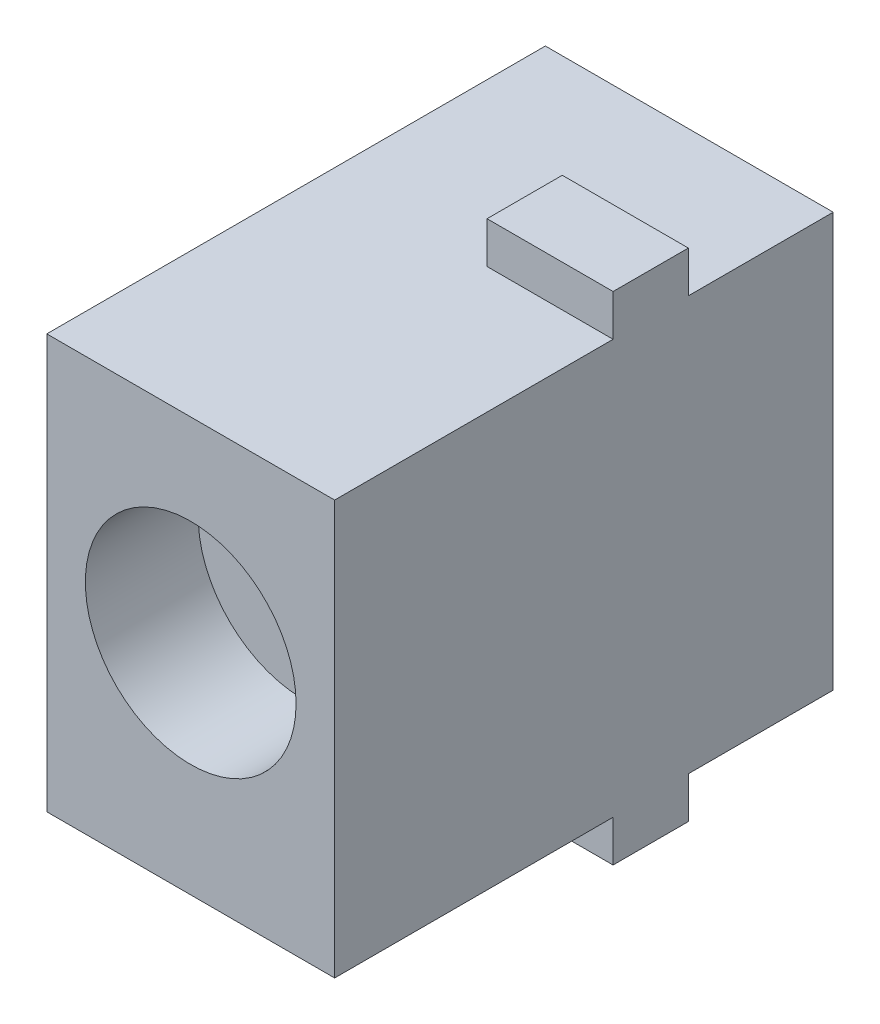
ISO-10303-21;
HEADER;
FILE_DESCRIPTION(('STEP AP214'),'2;1');
FILE_NAME('part.step','',(''),(''),'','','');
FILE_SCHEMA(('AUTOMOTIVE_DESIGN { 1 0 10303 214 1 1 1 1 }'));
ENDSEC;
DATA;
#1=APPLICATION_CONTEXT('core data for automotive mechanical design processes');
#2=APPLICATION_PROTOCOL_DEFINITION('international standard','automotive_design',2000,#1);
#3=PRODUCT_CONTEXT('',#1,'mechanical');
#4=PRODUCT('Part','Part','',(#3));
#5=PRODUCT_RELATED_PRODUCT_CATEGORY('part','',(#4));
#6=PRODUCT_DEFINITION_FORMATION('','',#4);
#7=PRODUCT_DEFINITION_CONTEXT('part definition',#1,'design');
#8=PRODUCT_DEFINITION('design','',#6,#7);
#9=PRODUCT_DEFINITION_SHAPE('','',#8);
#10=(LENGTH_UNIT() NAMED_UNIT(*) SI_UNIT(.MILLI.,.METRE.));
#11=(NAMED_UNIT(*) PLANE_ANGLE_UNIT() SI_UNIT($,.RADIAN.));
#12=(NAMED_UNIT(*) SI_UNIT($,.STERADIAN.) SOLID_ANGLE_UNIT());
#13=UNCERTAINTY_MEASURE_WITH_UNIT(LENGTH_MEASURE(1.E-05),#10,'distance_accuracy_value','');
#14=(GEOMETRIC_REPRESENTATION_CONTEXT(3) GLOBAL_UNCERTAINTY_ASSIGNED_CONTEXT((#13)) GLOBAL_UNIT_ASSIGNED_CONTEXT((#10,
#11,#12)) REPRESENTATION_CONTEXT('',''));
#15=CARTESIAN_POINT('',(0.,0.,0.));
#16=DIRECTION('',(0.,0.,1.));
#17=DIRECTION('',(1.,0.,0.));
#18=AXIS2_PLACEMENT_3D('',#15,#16,#17);
#19=CARTESIAN_POINT('',(3.825,5.5,13.25));
#20=DIRECTION('',(0.,-1.,0.));
#21=DIRECTION('',(1.,0.,0.));
#22=AXIS2_PLACEMENT_3D('',#19,#20,#21);
#23=PLANE('',#22);
#24=DIRECTION('',(1.,0.,0.));
#25=VECTOR('',#24,1.);
#26=CARTESIAN_POINT('',(3.825,5.5,5.85));
#27=LINE('',#26,#25);
#28=CARTESIAN_POINT('',(0.474999999999999,5.5,5.85));
#29=VERTEX_POINT('',#28);
#30=CARTESIAN_POINT('',(3.825,5.5,5.85));
#31=VERTEX_POINT('',#30);
#32=EDGE_CURVE('E58',#29,#31,#27,.T.);
#33=ORIENTED_EDGE('',*,*,#32,.F.);
#34=DIRECTION('',(0.,0.,1.));
#35=VECTOR('',#34,1.);
#36=CARTESIAN_POINT('',(0.474999999999999,5.5,3.85));
#37=LINE('',#36,#35);
#38=CARTESIAN_POINT('',(0.474999999999999,5.5,3.85));
#39=VERTEX_POINT('',#38);
#40=EDGE_CURVE('E177',#39,#29,#37,.T.);
#41=ORIENTED_EDGE('',*,*,#40,.F.);
#42=DIRECTION('',(-1.,0.,0.));
#43=VECTOR('',#42,1.);
#44=CARTESIAN_POINT('',(3.825,5.5,3.85));
#45=LINE('',#44,#43);
#46=CARTESIAN_POINT('',(3.825,5.5,3.85));
#47=VERTEX_POINT('',#46);
#48=EDGE_CURVE('E132',#47,#39,#45,.T.);
#49=ORIENTED_EDGE('',*,*,#48,.F.);
#50=DIRECTION('',(0.,0.,-1.));
#51=VECTOR('',#50,1.);
#52=CARTESIAN_POINT('',(3.825,5.5,13.25));
#53=LINE('',#52,#51);
#54=CARTESIAN_POINT('',(3.825,5.5,0.));
#55=VERTEX_POINT('',#54);
#56=EDGE_CURVE('E213',#47,#55,#53,.T.);
#57=ORIENTED_EDGE('',*,*,#56,.T.);
#58=DIRECTION('',(-1.,0.,0.));
#59=VECTOR('',#58,1.);
#60=CARTESIAN_POINT('',(3.825,5.5,0.));
#61=LINE('',#60,#59);
#62=CARTESIAN_POINT('',(-3.825,5.5,0.));
#63=VERTEX_POINT('',#62);
#64=EDGE_CURVE('E196',#55,#63,#61,.T.);
#65=ORIENTED_EDGE('',*,*,#64,.T.);
#66=DIRECTION('',(0.,0.,-1.));
#67=VECTOR('',#66,1.);
#68=CARTESIAN_POINT('',(-3.825,5.5,13.25));
#69=LINE('',#68,#67);
#70=CARTESIAN_POINT('',(-3.825,5.5,13.25));
#71=VERTEX_POINT('',#70);
#72=EDGE_CURVE('E202',#71,#63,#69,.T.);
#73=ORIENTED_EDGE('',*,*,#72,.F.);
#74=DIRECTION('',(-1.,0.,0.));
#75=VECTOR('',#74,1.);
#76=CARTESIAN_POINT('',(3.825,5.5,13.25));
#77=LINE('',#76,#75);
#78=CARTESIAN_POINT('',(3.825,5.5,13.25));
#79=VERTEX_POINT('',#78);
#80=EDGE_CURVE('E200',#79,#71,#77,.T.);
#81=ORIENTED_EDGE('',*,*,#80,.F.);
#82=EDGE_CURVE('E214',#79,#31,#53,.T.);
#83=ORIENTED_EDGE('',*,*,#82,.T.);
#84=EDGE_LOOP('',(#33,#41,#49,#57,#65,#73,#81,#83));
#85=FACE_BOUND('',#84,.T.);
#86=ADVANCED_FACE('F35',(#85),#23,.F.);
#87=CARTESIAN_POINT('',(-3.825,5.5,13.25));
#88=DIRECTION('',(1.,0.,0.));
#89=DIRECTION('',(0.,1.,0.));
#90=AXIS2_PLACEMENT_3D('',#87,#88,#89);
#91=PLANE('',#90);
#92=DIRECTION('',(0.,-1.,0.));
#93=VECTOR('',#92,1.);
#94=CARTESIAN_POINT('',(-3.825,5.5,0.));
#95=LINE('',#94,#93);
#96=CARTESIAN_POINT('',(-3.825,-5.5,0.));
#97=VERTEX_POINT('',#96);
#98=EDGE_CURVE('E191',#63,#97,#95,.T.);
#99=ORIENTED_EDGE('',*,*,#98,.T.);
#100=DIRECTION('',(0.,0.,-1.));
#101=VECTOR('',#100,1.);
#102=CARTESIAN_POINT('',(-3.825,-5.5,13.25));
#103=LINE('',#102,#101);
#104=CARTESIAN_POINT('',(-3.825,-5.5,13.25));
#105=VERTEX_POINT('',#104);
#106=EDGE_CURVE('E11',#105,#97,#103,.T.);
#107=ORIENTED_EDGE('',*,*,#106,.F.);
#108=DIRECTION('',(0.,-1.,0.));
#109=VECTOR('',#108,1.);
#110=CARTESIAN_POINT('',(-3.825,5.5,13.25));
#111=LINE('',#110,#109);
#112=EDGE_CURVE('E192',#71,#105,#111,.T.);
#113=ORIENTED_EDGE('',*,*,#112,.F.);
#114=ORIENTED_EDGE('',*,*,#72,.T.);
#115=EDGE_LOOP('',(#99,#107,#113,#114));
#116=FACE_BOUND('',#115,.T.);
#117=ADVANCED_FACE('F37',(#116),#91,.F.);
#118=CARTESIAN_POINT('',(3.825,-5.5,13.25));
#119=DIRECTION('',(0.,1.,0.));
#120=DIRECTION('',(-1.,0.,0.));
#121=AXIS2_PLACEMENT_3D('',#118,#119,#120);
#122=PLANE('',#121);
#123=DIRECTION('',(0.,0.,-1.));
#124=VECTOR('',#123,1.);
#125=CARTESIAN_POINT('',(3.825,-5.5,13.25));
#126=LINE('',#125,#124);
#127=CARTESIAN_POINT('',(3.825,-5.5,3.85));
#128=VERTEX_POINT('',#127);
#129=CARTESIAN_POINT('',(3.825,-5.5,0.));
#130=VERTEX_POINT('',#129);
#131=EDGE_CURVE('E215',#128,#130,#126,.T.);
#132=ORIENTED_EDGE('',*,*,#131,.F.);
#133=DIRECTION('',(-1.,0.,0.));
#134=VECTOR('',#133,1.);
#135=CARTESIAN_POINT('',(3.825,-5.5,3.85));
#136=LINE('',#135,#134);
#137=CARTESIAN_POINT('',(0.474999999999999,-5.5,3.85));
#138=VERTEX_POINT('',#137);
#139=EDGE_CURVE('E143',#128,#138,#136,.T.);
#140=ORIENTED_EDGE('',*,*,#139,.T.);
#141=DIRECTION('',(0.,0.,1.));
#142=VECTOR('',#141,1.);
#143=CARTESIAN_POINT('',(0.474999999999999,-5.5,3.85));
#144=LINE('',#143,#142);
#145=CARTESIAN_POINT('',(0.474999999999999,-5.5,5.85));
#146=VERTEX_POINT('',#145);
#147=EDGE_CURVE('E155',#138,#146,#144,.T.);
#148=ORIENTED_EDGE('',*,*,#147,.T.);
#149=DIRECTION('',(1.,0.,0.));
#150=VECTOR('',#149,1.);
#151=CARTESIAN_POINT('',(3.825,-5.5,5.85));
#152=LINE('',#151,#150);
#153=CARTESIAN_POINT('',(3.825,-5.5,5.85));
#154=VERTEX_POINT('',#153);
#155=EDGE_CURVE('E153',#146,#154,#152,.T.);
#156=ORIENTED_EDGE('',*,*,#155,.T.);
#157=CARTESIAN_POINT('',(3.825,-5.5,13.25));
#158=VERTEX_POINT('',#157);
#159=EDGE_CURVE('E43',#158,#154,#126,.T.);
#160=ORIENTED_EDGE('',*,*,#159,.F.);
#161=DIRECTION('',(1.,0.,0.));
#162=VECTOR('',#161,1.);
#163=CARTESIAN_POINT('',(3.825,-5.5,13.25));
#164=LINE('',#163,#162);
#165=EDGE_CURVE('E195',#105,#158,#164,.T.);
#166=ORIENTED_EDGE('',*,*,#165,.F.);
#167=ORIENTED_EDGE('',*,*,#106,.T.);
#168=DIRECTION('',(1.,0.,0.));
#169=VECTOR('',#168,1.);
#170=CARTESIAN_POINT('',(3.825,-5.5,0.));
#171=LINE('',#170,#169);
#172=EDGE_CURVE('E205',#97,#130,#171,.T.);
#173=ORIENTED_EDGE('',*,*,#172,.T.);
#174=EDGE_LOOP('',(#132,#140,#148,#156,#160,#166,#167,#173));
#175=FACE_BOUND('',#174,.T.);
#176=ADVANCED_FACE('F222',(#175),#122,.F.);
#177=CARTESIAN_POINT('',(3.825,5.5,13.25));
#178=DIRECTION('',(-1.,0.,0.));
#179=DIRECTION('',(0.,-1.,0.));
#180=AXIS2_PLACEMENT_3D('',#177,#178,#179);
#181=PLANE('',#180);
#182=DIRECTION('',(0.,1.,0.));
#183=VECTOR('',#182,1.);
#184=CARTESIAN_POINT('',(3.825,5.5,0.));
#185=LINE('',#184,#183);
#186=EDGE_CURVE('E208',#130,#55,#185,.T.);
#187=ORIENTED_EDGE('',*,*,#186,.T.);
#188=ORIENTED_EDGE('',*,*,#56,.F.);
#189=DIRECTION('',(0.,-1.,0.));
#190=VECTOR('',#189,1.);
#191=CARTESIAN_POINT('',(3.825,6.6,3.85));
#192=LINE('',#191,#190);
#193=CARTESIAN_POINT('',(3.825,6.6,3.85));
#194=VERTEX_POINT('',#193);
#195=EDGE_CURVE('E188',#194,#47,#192,.T.);
#196=ORIENTED_EDGE('',*,*,#195,.F.);
#197=DIRECTION('',(0.,0.,-1.));
#198=VECTOR('',#197,1.);
#199=CARTESIAN_POINT('',(3.825,6.6,3.85));
#200=LINE('',#199,#198);
#201=CARTESIAN_POINT('',(3.825,6.6,5.85));
#202=VERTEX_POINT('',#201);
#203=EDGE_CURVE('E165',#202,#194,#200,.T.);
#204=ORIENTED_EDGE('',*,*,#203,.F.);
#205=DIRECTION('',(0.,-1.,0.));
#206=VECTOR('',#205,1.);
#207=CARTESIAN_POINT('',(3.825,6.6,5.85));
#208=LINE('',#207,#206);
#209=EDGE_CURVE('E174',#202,#31,#208,.T.);
#210=ORIENTED_EDGE('',*,*,#209,.T.);
#211=ORIENTED_EDGE('',*,*,#82,.F.);
#212=DIRECTION('',(0.,1.,0.));
#213=VECTOR('',#212,1.);
#214=CARTESIAN_POINT('',(3.825,5.5,13.25));
#215=LINE('',#214,#213);
#216=EDGE_CURVE('E198',#158,#79,#215,.T.);
#217=ORIENTED_EDGE('',*,*,#216,.F.);
#218=ORIENTED_EDGE('',*,*,#159,.T.);
#219=DIRECTION('',(0.,1.,0.));
#220=VECTOR('',#219,1.);
#221=CARTESIAN_POINT('',(3.825,-6.6,5.85));
#222=LINE('',#221,#220);
#223=CARTESIAN_POINT('',(3.825,-6.6,5.85));
#224=VERTEX_POINT('',#223);
#225=EDGE_CURVE('E50',#224,#154,#222,.T.);
#226=ORIENTED_EDGE('',*,*,#225,.F.);
#227=DIRECTION('',(0.,0.,-1.));
#228=VECTOR('',#227,1.);
#229=CARTESIAN_POINT('',(3.825,-6.6,3.85));
#230=LINE('',#229,#228);
#231=CARTESIAN_POINT('',(3.825,-6.6,3.85));
#232=VERTEX_POINT('',#231);
#233=EDGE_CURVE('E128',#224,#232,#230,.T.);
#234=ORIENTED_EDGE('',*,*,#233,.T.);
#235=DIRECTION('',(0.,1.,0.));
#236=VECTOR('',#235,1.);
#237=CARTESIAN_POINT('',(3.825,-6.6,3.85));
#238=LINE('',#237,#236);
#239=EDGE_CURVE('E152',#232,#128,#238,.T.);
#240=ORIENTED_EDGE('',*,*,#239,.T.);
#241=ORIENTED_EDGE('',*,*,#131,.T.);
#242=EDGE_LOOP('',(#187,#188,#196,#204,#210,#211,#217,#218,#226,#234,#240,#241));
#243=FACE_BOUND('',#242,.T.);
#244=ADVANCED_FACE('F127',(#243),#181,.F.);
#245=CARTESIAN_POINT('',(0.,0.,13.25));
#246=DIRECTION('',(0.,0.,-1.));
#247=DIRECTION('',(-1.,0.,0.));
#248=AXIS2_PLACEMENT_3D('',#245,#246,#247);
#249=PLANE('',#248);
#250=CARTESIAN_POINT('',(0.,0.3,13.25));
#251=DIRECTION('',(0.,0.,1.));
#252=DIRECTION('',(1.,0.,0.));
#253=AXIS2_PLACEMENT_3D('',#250,#251,#252);
#254=CIRCLE('',#253,2.8);
#255=CARTESIAN_POINT('',(2.8,0.3,13.25));
#256=VERTEX_POINT('',#255);
#257=EDGE_CURVE('E392',#256,#256,#254,.T.);
#258=ORIENTED_EDGE('',*,*,#257,.F.);
#259=EDGE_LOOP('',(#258));
#260=FACE_BOUND('',#259,.T.);
#261=ORIENTED_EDGE('',*,*,#112,.T.);
#262=ORIENTED_EDGE('',*,*,#165,.T.);
#263=ORIENTED_EDGE('',*,*,#216,.T.);
#264=ORIENTED_EDGE('',*,*,#80,.T.);
#265=EDGE_LOOP('',(#261,#262,#263,#264));
#266=FACE_BOUND('',#265,.T.);
#267=ADVANCED_FACE('F232',(#260,#266),#249,.F.);
#268=CARTESIAN_POINT('',(0.,0.,0.));
#269=DIRECTION('',(0.,0.,-1.));
#270=DIRECTION('',(-1.,0.,0.));
#271=AXIS2_PLACEMENT_3D('',#268,#269,#270);
#272=PLANE('',#271);
#273=ORIENTED_EDGE('',*,*,#98,.F.);
#274=ORIENTED_EDGE('',*,*,#64,.F.);
#275=ORIENTED_EDGE('',*,*,#186,.F.);
#276=ORIENTED_EDGE('',*,*,#172,.F.);
#277=EDGE_LOOP('',(#273,#274,#275,#276));
#278=FACE_BOUND('',#277,.T.);
#279=ADVANCED_FACE('F226',(#278),#272,.T.);
#280=CARTESIAN_POINT('',(3.825,6.6,3.85));
#281=DIRECTION('',(0.,0.,1.));
#282=DIRECTION('',(1.,0.,0.));
#283=AXIS2_PLACEMENT_3D('',#280,#281,#282);
#284=PLANE('',#283);
#285=ORIENTED_EDGE('',*,*,#48,.T.);
#286=DIRECTION('',(0.,-1.,0.));
#287=VECTOR('',#286,1.);
#288=CARTESIAN_POINT('',(0.474999999999999,6.6,3.85));
#289=LINE('',#288,#287);
#290=CARTESIAN_POINT('',(0.474999999999999,6.6,3.85));
#291=VERTEX_POINT('',#290);
#292=EDGE_CURVE('E185',#291,#39,#289,.T.);
#293=ORIENTED_EDGE('',*,*,#292,.F.);
#294=DIRECTION('',(-1.,0.,0.));
#295=VECTOR('',#294,1.);
#296=CARTESIAN_POINT('',(3.825,6.6,3.85));
#297=LINE('',#296,#295);
#298=EDGE_CURVE('E168',#194,#291,#297,.T.);
#299=ORIENTED_EDGE('',*,*,#298,.F.);
#300=ORIENTED_EDGE('',*,*,#195,.T.);
#301=EDGE_LOOP('',(#285,#293,#299,#300));
#302=FACE_BOUND('',#301,.T.);
#303=ADVANCED_FACE('F248',(#302),#284,.F.);
#304=CARTESIAN_POINT('',(0.474999999999999,6.6,3.85));
#305=DIRECTION('',(1.,0.,0.));
#306=DIRECTION('',(0.,0.,-1.));
#307=AXIS2_PLACEMENT_3D('',#304,#305,#306);
#308=PLANE('',#307);
#309=ORIENTED_EDGE('',*,*,#40,.T.);
#310=DIRECTION('',(0.,-1.,0.));
#311=VECTOR('',#310,1.);
#312=CARTESIAN_POINT('',(0.474999999999999,6.6,5.85));
#313=LINE('',#312,#311);
#314=CARTESIAN_POINT('',(0.474999999999999,6.6,5.85));
#315=VERTEX_POINT('',#314);
#316=EDGE_CURVE('E182',#315,#29,#313,.T.);
#317=ORIENTED_EDGE('',*,*,#316,.F.);
#318=DIRECTION('',(0.,0.,1.));
#319=VECTOR('',#318,1.);
#320=CARTESIAN_POINT('',(0.474999999999999,6.6,3.85));
#321=LINE('',#320,#319);
#322=EDGE_CURVE('E170',#291,#315,#321,.T.);
#323=ORIENTED_EDGE('',*,*,#322,.F.);
#324=ORIENTED_EDGE('',*,*,#292,.T.);
#325=EDGE_LOOP('',(#309,#317,#323,#324));
#326=FACE_BOUND('',#325,.T.);
#327=ADVANCED_FACE('F246',(#326),#308,.F.);
#328=CARTESIAN_POINT('',(3.825,6.6,5.85));
#329=DIRECTION('',(0.,0.,-1.));
#330=DIRECTION('',(-1.,0.,0.));
#331=AXIS2_PLACEMENT_3D('',#328,#329,#330);
#332=PLANE('',#331);
#333=ORIENTED_EDGE('',*,*,#32,.T.);
#334=ORIENTED_EDGE('',*,*,#209,.F.);
#335=DIRECTION('',(1.,0.,0.));
#336=VECTOR('',#335,1.);
#337=CARTESIAN_POINT('',(3.825,6.6,5.85));
#338=LINE('',#337,#336);
#339=EDGE_CURVE('E172',#315,#202,#338,.T.);
#340=ORIENTED_EDGE('',*,*,#339,.F.);
#341=ORIENTED_EDGE('',*,*,#316,.T.);
#342=EDGE_LOOP('',(#333,#334,#340,#341));
#343=FACE_BOUND('',#342,.T.);
#344=ADVANCED_FACE('F236',(#343),#332,.F.);
#345=CARTESIAN_POINT('',(0.,6.6,0.));
#346=DIRECTION('',(0.,-1.,0.));
#347=DIRECTION('',(0.,0.,-1.));
#348=AXIS2_PLACEMENT_3D('',#345,#346,#347);
#349=PLANE('',#348);
#350=ORIENTED_EDGE('',*,*,#203,.T.);
#351=ORIENTED_EDGE('',*,*,#298,.T.);
#352=ORIENTED_EDGE('',*,*,#322,.T.);
#353=ORIENTED_EDGE('',*,*,#339,.T.);
#354=EDGE_LOOP('',(#350,#351,#352,#353));
#355=FACE_BOUND('',#354,.T.);
#356=ADVANCED_FACE('F242',(#355),#349,.F.);
#357=CARTESIAN_POINT('',(3.825,-6.6,5.85));
#358=DIRECTION('',(0.,0.,1.));
#359=DIRECTION('',(1.,0.,0.));
#360=AXIS2_PLACEMENT_3D('',#357,#358,#359);
#361=PLANE('',#360);
#362=ORIENTED_EDGE('',*,*,#155,.F.);
#363=DIRECTION('',(0.,1.,0.));
#364=VECTOR('',#363,1.);
#365=CARTESIAN_POINT('',(0.474999999999999,-6.6,5.85));
#366=LINE('',#365,#364);
#367=CARTESIAN_POINT('',(0.474999999999999,-6.6,5.85));
#368=VERTEX_POINT('',#367);
#369=EDGE_CURVE('E133',#368,#146,#366,.T.);
#370=ORIENTED_EDGE('',*,*,#369,.F.);
#371=DIRECTION('',(1.,0.,0.));
#372=VECTOR('',#371,1.);
#373=CARTESIAN_POINT('',(3.825,-6.6,5.85));
#374=LINE('',#373,#372);
#375=EDGE_CURVE('E139',#368,#224,#374,.T.);
#376=ORIENTED_EDGE('',*,*,#375,.T.);
#377=ORIENTED_EDGE('',*,*,#225,.T.);
#378=EDGE_LOOP('',(#362,#370,#376,#377));
#379=FACE_BOUND('',#378,.T.);
#380=ADVANCED_FACE('F145',(#379),#361,.T.);
#381=CARTESIAN_POINT('',(0.474999999999999,-6.6,3.85));
#382=DIRECTION('',(-1.,0.,0.));
#383=DIRECTION('',(0.,0.,1.));
#384=AXIS2_PLACEMENT_3D('',#381,#382,#383);
#385=PLANE('',#384);
#386=ORIENTED_EDGE('',*,*,#147,.F.);
#387=DIRECTION('',(0.,1.,0.));
#388=VECTOR('',#387,1.);
#389=CARTESIAN_POINT('',(0.474999999999999,-6.6,3.85));
#390=LINE('',#389,#388);
#391=CARTESIAN_POINT('',(0.474999999999999,-6.6,3.85));
#392=VERTEX_POINT('',#391);
#393=EDGE_CURVE('E162',#392,#138,#390,.T.);
#394=ORIENTED_EDGE('',*,*,#393,.F.);
#395=DIRECTION('',(0.,0.,1.));
#396=VECTOR('',#395,1.);
#397=CARTESIAN_POINT('',(0.474999999999999,-6.6,3.85));
#398=LINE('',#397,#396);
#399=EDGE_CURVE('E146',#392,#368,#398,.T.);
#400=ORIENTED_EDGE('',*,*,#399,.T.);
#401=ORIENTED_EDGE('',*,*,#369,.T.);
#402=EDGE_LOOP('',(#386,#394,#400,#401));
#403=FACE_BOUND('',#402,.T.);
#404=ADVANCED_FACE('F327',(#403),#385,.T.);
#405=CARTESIAN_POINT('',(3.825,-6.6,3.85));
#406=DIRECTION('',(0.,0.,-1.));
#407=DIRECTION('',(-1.,0.,0.));
#408=AXIS2_PLACEMENT_3D('',#405,#406,#407);
#409=PLANE('',#408);
#410=ORIENTED_EDGE('',*,*,#139,.F.);
#411=ORIENTED_EDGE('',*,*,#239,.F.);
#412=DIRECTION('',(-1.,0.,0.));
#413=VECTOR('',#412,1.);
#414=CARTESIAN_POINT('',(3.825,-6.6,3.85));
#415=LINE('',#414,#413);
#416=EDGE_CURVE('E142',#232,#392,#415,.T.);
#417=ORIENTED_EDGE('',*,*,#416,.T.);
#418=ORIENTED_EDGE('',*,*,#393,.T.);
#419=EDGE_LOOP('',(#410,#411,#417,#418));
#420=FACE_BOUND('',#419,.T.);
#421=ADVANCED_FACE('F334',(#420),#409,.T.);
#422=CARTESIAN_POINT('',(0.,-6.6,0.));
#423=DIRECTION('',(0.,1.,0.));
#424=DIRECTION('',(0.,0.,-1.));
#425=AXIS2_PLACEMENT_3D('',#422,#423,#424);
#426=PLANE('',#425);
#427=ORIENTED_EDGE('',*,*,#233,.F.);
#428=ORIENTED_EDGE('',*,*,#375,.F.);
#429=ORIENTED_EDGE('',*,*,#399,.F.);
#430=ORIENTED_EDGE('',*,*,#416,.F.);
#431=EDGE_LOOP('',(#427,#428,#429,#430));
#432=FACE_BOUND('',#431,.T.);
#433=ADVANCED_FACE('F137',(#432),#426,.F.);
#434=CARTESIAN_POINT('',(0.,0.3,10.25));
#435=DIRECTION('',(0.,0.,1.));
#436=DIRECTION('',(1.,0.,0.));
#437=AXIS2_PLACEMENT_3D('',#434,#435,#436);
#438=CYLINDRICAL_SURFACE('',#437,2.8);
#439=CARTESIAN_POINT('',(0.,0.3,10.25));
#440=DIRECTION('',(0.,0.,1.));
#441=DIRECTION('',(1.,0.,0.));
#442=AXIS2_PLACEMENT_3D('',#439,#440,#441);
#443=CIRCLE('',#442,2.8);
#444=CARTESIAN_POINT('',(2.8,0.3,10.25));
#445=VERTEX_POINT('',#444);
#446=EDGE_CURVE('E156',#445,#445,#443,.T.);
#447=ORIENTED_EDGE('',*,*,#446,.F.);
#448=EDGE_LOOP('',(#447));
#449=FACE_BOUND('',#448,.T.);
#450=ORIENTED_EDGE('',*,*,#257,.T.);
#451=EDGE_LOOP('',(#450));
#452=FACE_BOUND('',#451,.T.);
#453=ADVANCED_FACE('F348',(#449,#452),#438,.F.);
#454=CARTESIAN_POINT('',(0.,0.3,10.25));
#455=DIRECTION('',(0.,0.,1.));
#456=DIRECTION('',(1.,0.,0.));
#457=AXIS2_PLACEMENT_3D('',#454,#455,#456);
#458=PLANE('',#457);
#459=ORIENTED_EDGE('',*,*,#446,.T.);
#460=EDGE_LOOP('',(#459));
#461=FACE_BOUND('',#460,.T.);
#462=ADVANCED_FACE('F354',(#461),#458,.T.);
#463=CLOSED_SHELL('',(#86,#117,#176,#244,#267,#279,#303,#327,#344,#356,#380,#404,#421,#433,#453,#462));
#464=MANIFOLD_SOLID_BREP('B2',#463);
#465=ADVANCED_BREP_SHAPE_REPRESENTATION('',(#18,#464),#14);
#466=SHAPE_DEFINITION_REPRESENTATION(#9,#465);
ENDSEC;
END-ISO-10303-21;
